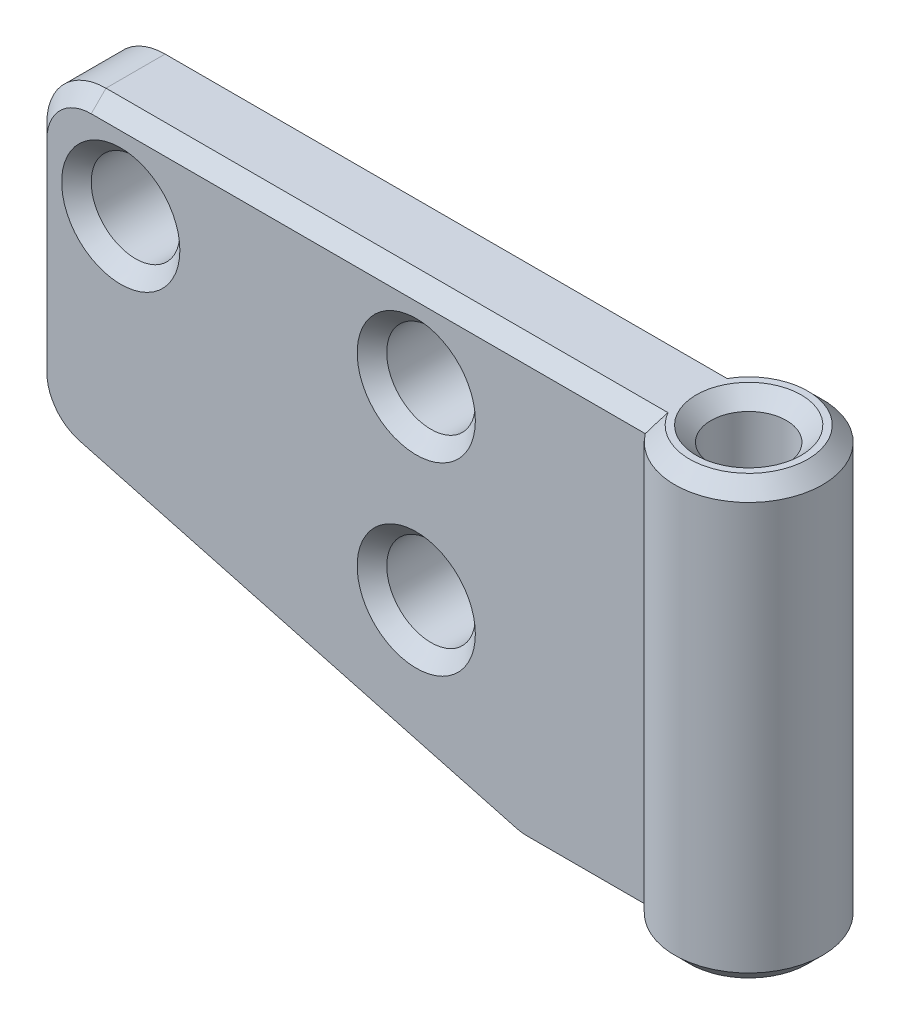
ISO-10303-21;
HEADER;
FILE_DESCRIPTION(('STEP AP214'),'2;1');
FILE_NAME('part.step','',(''),(''),'','','');
FILE_SCHEMA(('AUTOMOTIVE_DESIGN { 1 0 10303 214 1 1 1 1 }'));
ENDSEC;
DATA;
#1=APPLICATION_CONTEXT('core data for automotive mechanical design processes');
#2=APPLICATION_PROTOCOL_DEFINITION('international standard','automotive_design',2000,#1);
#3=PRODUCT_CONTEXT('',#1,'mechanical');
#4=PRODUCT('Part','Part','',(#3));
#5=PRODUCT_RELATED_PRODUCT_CATEGORY('part','',(#4));
#6=PRODUCT_DEFINITION_FORMATION('','',#4);
#7=PRODUCT_DEFINITION_CONTEXT('part definition',#1,'design');
#8=PRODUCT_DEFINITION('design','',#6,#7);
#9=PRODUCT_DEFINITION_SHAPE('','',#8);
#10=(LENGTH_UNIT() NAMED_UNIT(*) SI_UNIT(.MILLI.,.METRE.));
#11=(NAMED_UNIT(*) PLANE_ANGLE_UNIT() SI_UNIT($,.RADIAN.));
#12=(NAMED_UNIT(*) SI_UNIT($,.STERADIAN.) SOLID_ANGLE_UNIT());
#13=UNCERTAINTY_MEASURE_WITH_UNIT(LENGTH_MEASURE(1.E-05),#10,'distance_accuracy_value','');
#14=(GEOMETRIC_REPRESENTATION_CONTEXT(3) GLOBAL_UNCERTAINTY_ASSIGNED_CONTEXT((#13)) GLOBAL_UNIT_ASSIGNED_CONTEXT((#10,
#11,#12)) REPRESENTATION_CONTEXT('',''));
#15=CARTESIAN_POINT('',(0.,0.,0.));
#16=DIRECTION('',(0.,0.,1.));
#17=DIRECTION('',(1.,0.,0.));
#18=AXIS2_PLACEMENT_3D('',#15,#16,#17);
#19=CARTESIAN_POINT('',(27.5266099903496,-19.58,6.));
#20=DIRECTION('',(0.,0.,1.));
#21=DIRECTION('',(1.,0.,0.));
#22=AXIS2_PLACEMENT_3D('',#19,#20,#21);
#23=PLANE('',#22);
#24=CARTESIAN_POINT('',(0.,0.,6.));
#25=DIRECTION('',(0.,0.,1.));
#26=DIRECTION('',(1.,0.,0.));
#27=AXIS2_PLACEMENT_3D('',#24,#25,#26);
#28=CIRCLE('',#27,4.);
#29=CARTESIAN_POINT('',(4.,0.,6.));
#30=VERTEX_POINT('',#29);
#31=EDGE_CURVE('E191',#30,#30,#28,.F.);
#32=ORIENTED_EDGE('',*,*,#31,.T.);
#33=EDGE_LOOP('',(#32));
#34=FACE_BOUND('',#33,.T.);
#35=CARTESIAN_POINT('',(20.,-12.5,6.));
#36=DIRECTION('',(0.,0.,1.));
#37=DIRECTION('',(1.,0.,0.));
#38=AXIS2_PLACEMENT_3D('',#35,#36,#37);
#39=CIRCLE('',#38,4.00000000000001);
#40=CARTESIAN_POINT('',(24.,-12.5,6.));
#41=VERTEX_POINT('',#40);
#42=EDGE_CURVE('E469',#41,#41,#39,.F.);
#43=ORIENTED_EDGE('',*,*,#42,.T.);
#44=EDGE_LOOP('',(#43));
#45=FACE_BOUND('',#44,.T.);
#46=CARTESIAN_POINT('',(20.,0.,6.));
#47=DIRECTION('',(0.,0.,1.));
#48=DIRECTION('',(1.,0.,0.));
#49=AXIS2_PLACEMENT_3D('',#46,#47,#48);
#50=CIRCLE('',#49,4.00000000000001);
#51=CARTESIAN_POINT('',(24.,0.,6.));
#52=VERTEX_POINT('',#51);
#53=EDGE_CURVE('E472',#52,#52,#50,.F.);
#54=ORIENTED_EDGE('',*,*,#53,.T.);
#55=EDGE_LOOP('',(#54));
#56=FACE_BOUND('',#55,.T.);
#57=CARTESIAN_POINT('',(27.5266099903496,-19.58,6.));
#58=DIRECTION('',(0.,0.,1.));
#59=DIRECTION('',(1.,0.,0.));
#60=AXIS2_PLACEMENT_3D('',#57,#58,#59);
#61=CIRCLE('',#60,3.);
#62=CARTESIAN_POINT('',(26.750152855042,-22.4777774788672,6.));
#63=VERTEX_POINT('',#62);
#64=CARTESIAN_POINT('',(27.5266099903496,-22.58,6.));
#65=VERTEX_POINT('',#64);
#66=EDGE_CURVE('E477',#63,#65,#61,.T.);
#67=ORIENTED_EDGE('',*,*,#66,.T.);
#68=DIRECTION('',(1.,0.,0.));
#69=VECTOR('',#68,1.);
#70=CARTESIAN_POINT('',(35.5,-22.58,6.));
#71=LINE('',#70,#69);
#72=CARTESIAN_POINT('',(35.5,-22.58,6.));
#73=VERTEX_POINT('',#72);
#74=EDGE_CURVE('E475',#65,#73,#71,.T.);
#75=ORIENTED_EDGE('',*,*,#74,.T.);
#76=DIRECTION('',(0.,1.,0.));
#77=VECTOR('',#76,1.);
#78=CARTESIAN_POINT('',(35.5,-23.58,6.));
#79=LINE('',#78,#77);
#80=CARTESIAN_POINT('',(35.5,5.,6.));
#81=VERTEX_POINT('',#80);
#82=EDGE_CURVE('E181',#81,#73,#79,.F.);
#83=ORIENTED_EDGE('',*,*,#82,.F.);
#84=DIRECTION('',(-1.,0.,0.));
#85=VECTOR('',#84,1.);
#86=CARTESIAN_POINT('',(-1.99999999999997,5.,6.));
#87=LINE('',#86,#85);
#88=CARTESIAN_POINT('',(-1.99999999999998,5.,6.));
#89=VERTEX_POINT('',#88);
#90=EDGE_CURVE('E421',#81,#89,#87,.T.);
#91=ORIENTED_EDGE('',*,*,#90,.T.);
#92=CARTESIAN_POINT('',(-2.,2.,6.));
#93=DIRECTION('',(0.,0.,1.));
#94=DIRECTION('',(1.,0.,0.));
#95=AXIS2_PLACEMENT_3D('',#92,#93,#94);
#96=CIRCLE('',#95,3.);
#97=CARTESIAN_POINT('',(-5.,1.99999999999997,6.));
#98=VERTEX_POINT('',#97);
#99=EDGE_CURVE('E420',#89,#98,#96,.T.);
#100=ORIENTED_EDGE('',*,*,#99,.T.);
#101=DIRECTION('',(0.,-1.,0.));
#102=VECTOR('',#101,1.);
#103=CARTESIAN_POINT('',(-5.,-11.6683686978573,6.));
#104=LINE('',#103,#102);
#105=CARTESIAN_POINT('',(-5.,-11.6683686978573,6.));
#106=VERTEX_POINT('',#105);
#107=EDGE_CURVE('E483',#98,#106,#104,.T.);
#108=ORIENTED_EDGE('',*,*,#107,.T.);
#109=CARTESIAN_POINT('',(-2.,-11.6683686978573,6.));
#110=DIRECTION('',(0.,0.,1.));
#111=DIRECTION('',(1.,0.,0.));
#112=AXIS2_PLACEMENT_3D('',#109,#110,#111);
#113=CIRCLE('',#112,3.);
#114=CARTESIAN_POINT('',(-2.77645713530754,-14.5661461767245,6.));
#115=VERTEX_POINT('',#114);
#116=EDGE_CURVE('E481',#106,#115,#113,.T.);
#117=ORIENTED_EDGE('',*,*,#116,.T.);
#118=DIRECTION('',(0.96592582628907,-0.258819045102514,0.));
#119=VECTOR('',#118,1.);
#120=CARTESIAN_POINT('',(26.750152855042,-22.4777774788672,6.));
#121=LINE('',#120,#119);
#122=EDGE_CURVE('E479',#115,#63,#121,.T.);
#123=ORIENTED_EDGE('',*,*,#122,.T.);
#124=EDGE_LOOP('',(#67,#75,#83,#91,#100,#108,#117,#123));
#125=FACE_BOUND('',#124,.T.);
#126=ADVANCED_FACE('F40',(#34,#45,#56,#125),#23,.T.);
#127=CARTESIAN_POINT('',(27.5266099903496,-19.58,0.));
#128=DIRECTION('',(0.,0.,1.));
#129=DIRECTION('',(1.,0.,0.));
#130=AXIS2_PLACEMENT_3D('',#127,#128,#129);
#131=PLANE('',#130);
#132=CARTESIAN_POINT('',(0.,0.,0.));
#133=DIRECTION('',(0.,0.,1.));
#134=DIRECTION('',(1.,0.,0.));
#135=AXIS2_PLACEMENT_3D('',#132,#133,#134);
#136=CIRCLE('',#135,4.);
#137=CARTESIAN_POINT('',(4.,0.,0.));
#138=VERTEX_POINT('',#137);
#139=EDGE_CURVE('E505',#138,#138,#136,.T.);
#140=ORIENTED_EDGE('',*,*,#139,.T.);
#141=EDGE_LOOP('',(#140));
#142=FACE_BOUND('',#141,.T.);
#143=CARTESIAN_POINT('',(20.,-12.5,0.));
#144=DIRECTION('',(0.,0.,1.));
#145=DIRECTION('',(1.,0.,0.));
#146=AXIS2_PLACEMENT_3D('',#143,#144,#145);
#147=CIRCLE('',#146,4.00000000000001);
#148=CARTESIAN_POINT('',(24.,-12.5,0.));
#149=VERTEX_POINT('',#148);
#150=EDGE_CURVE('E508',#149,#149,#147,.T.);
#151=ORIENTED_EDGE('',*,*,#150,.T.);
#152=EDGE_LOOP('',(#151));
#153=FACE_BOUND('',#152,.T.);
#154=CARTESIAN_POINT('',(20.,0.,0.));
#155=DIRECTION('',(0.,0.,1.));
#156=DIRECTION('',(1.,0.,0.));
#157=AXIS2_PLACEMENT_3D('',#154,#155,#156);
#158=CIRCLE('',#157,4.00000000000001);
#159=CARTESIAN_POINT('',(24.,0.,0.));
#160=VERTEX_POINT('',#159);
#161=EDGE_CURVE('E511',#160,#160,#158,.T.);
#162=ORIENTED_EDGE('',*,*,#161,.T.);
#163=EDGE_LOOP('',(#162));
#164=FACE_BOUND('',#163,.T.);
#165=DIRECTION('',(0.,1.,0.));
#166=VECTOR('',#165,1.);
#167=CARTESIAN_POINT('',(35.5,-23.58,0.));
#168=LINE('',#167,#166);
#169=CARTESIAN_POINT('',(35.5,5.,0.));
#170=VERTEX_POINT('',#169);
#171=CARTESIAN_POINT('',(35.5,-22.58,0.));
#172=VERTEX_POINT('',#171);
#173=EDGE_CURVE('E163',#170,#172,#168,.F.);
#174=ORIENTED_EDGE('',*,*,#173,.T.);
#175=DIRECTION('',(-1.,0.,0.));
#176=VECTOR('',#175,1.);
#177=CARTESIAN_POINT('',(27.5266099903496,-22.58,0.));
#178=LINE('',#177,#176);
#179=CARTESIAN_POINT('',(27.5266099903496,-22.58,0.));
#180=VERTEX_POINT('',#179);
#181=EDGE_CURVE('E514',#172,#180,#178,.T.);
#182=ORIENTED_EDGE('',*,*,#181,.T.);
#183=CARTESIAN_POINT('',(27.5266099903496,-19.58,0.));
#184=DIRECTION('',(0.,0.,1.));
#185=DIRECTION('',(1.,0.,0.));
#186=AXIS2_PLACEMENT_3D('',#183,#184,#185);
#187=CIRCLE('',#186,3.);
#188=CARTESIAN_POINT('',(26.750152855042,-22.4777774788672,0.));
#189=VERTEX_POINT('',#188);
#190=EDGE_CURVE('E516',#180,#189,#187,.F.);
#191=ORIENTED_EDGE('',*,*,#190,.T.);
#192=DIRECTION('',(-0.96592582628907,0.258819045102514,0.));
#193=VECTOR('',#192,1.);
#194=CARTESIAN_POINT('',(26.750152855042,-22.4777774788672,0.));
#195=LINE('',#194,#193);
#196=CARTESIAN_POINT('',(-2.77645713530754,-14.5661461767245,0.));
#197=VERTEX_POINT('',#196);
#198=EDGE_CURVE('E518',#189,#197,#195,.T.);
#199=ORIENTED_EDGE('',*,*,#198,.T.);
#200=CARTESIAN_POINT('',(-2.,-11.6683686978573,0.));
#201=DIRECTION('',(0.,0.,1.));
#202=DIRECTION('',(1.,0.,0.));
#203=AXIS2_PLACEMENT_3D('',#200,#201,#202);
#204=CIRCLE('',#203,3.);
#205=CARTESIAN_POINT('',(-5.,-11.6683686978573,0.));
#206=VERTEX_POINT('',#205);
#207=EDGE_CURVE('E520',#197,#206,#204,.F.);
#208=ORIENTED_EDGE('',*,*,#207,.T.);
#209=DIRECTION('',(0.,1.,0.));
#210=VECTOR('',#209,1.);
#211=CARTESIAN_POINT('',(-5.,-19.58,0.));
#212=LINE('',#211,#210);
#213=CARTESIAN_POINT('',(-5.,1.99999999999997,0.));
#214=VERTEX_POINT('',#213);
#215=EDGE_CURVE('E522',#206,#214,#212,.T.);
#216=ORIENTED_EDGE('',*,*,#215,.T.);
#217=CARTESIAN_POINT('',(-2.,2.,0.));
#218=DIRECTION('',(0.,0.,1.));
#219=DIRECTION('',(1.,0.,0.));
#220=AXIS2_PLACEMENT_3D('',#217,#218,#219);
#221=CIRCLE('',#220,3.);
#222=CARTESIAN_POINT('',(-1.99999999999998,5.,0.));
#223=VERTEX_POINT('',#222);
#224=EDGE_CURVE('E165',#214,#223,#221,.F.);
#225=ORIENTED_EDGE('',*,*,#224,.T.);
#226=DIRECTION('',(1.,0.,0.));
#227=VECTOR('',#226,1.);
#228=CARTESIAN_POINT('',(27.5266099903496,5.,0.));
#229=LINE('',#228,#227);
#230=EDGE_CURVE('E160',#223,#170,#229,.T.);
#231=ORIENTED_EDGE('',*,*,#230,.T.);
#232=EDGE_LOOP('',(#174,#182,#191,#199,#208,#216,#225,#231));
#233=FACE_BOUND('',#232,.T.);
#234=ADVANCED_FACE('F162',(#142,#153,#164,#233),#131,.F.);
#235=CARTESIAN_POINT('',(27.5266099903496,-19.58,6.));
#236=DIRECTION('',(0.,0.,-1.));
#237=DIRECTION('',(-1.,0.,0.));
#238=AXIS2_PLACEMENT_3D('',#235,#236,#237);
#239=CYLINDRICAL_SURFACE('',#238,4.);
#240=DIRECTION('',(0.,0.,-1.));
#241=VECTOR('',#240,1.);
#242=CARTESIAN_POINT('',(26.4913338099395,-23.4437033051563,6.));
#243=LINE('',#242,#241);
#244=CARTESIAN_POINT('',(26.4913338099395,-23.4437033051563,5.));
#245=VERTEX_POINT('',#244);
#246=CARTESIAN_POINT('',(26.4913338099395,-23.4437033051563,1.));
#247=VERTEX_POINT('',#246);
#248=EDGE_CURVE('E534',#245,#247,#243,.T.);
#249=ORIENTED_EDGE('',*,*,#248,.T.);
#250=CARTESIAN_POINT('',(27.5266099903496,-19.58,1.));
#251=DIRECTION('',(0.,0.,1.));
#252=DIRECTION('',(1.,0.,0.));
#253=AXIS2_PLACEMENT_3D('',#250,#251,#252);
#254=CIRCLE('',#253,4.);
#255=CARTESIAN_POINT('',(27.5266099903496,-23.58,1.));
#256=VERTEX_POINT('',#255);
#257=EDGE_CURVE('E456',#247,#256,#254,.T.);
#258=ORIENTED_EDGE('',*,*,#257,.T.);
#259=DIRECTION('',(0.,0.,-1.));
#260=VECTOR('',#259,1.);
#261=CARTESIAN_POINT('',(27.5266099903496,-23.58,6.));
#262=LINE('',#261,#260);
#263=CARTESIAN_POINT('',(27.5266099903496,-23.58,5.));
#264=VERTEX_POINT('',#263);
#265=EDGE_CURVE('E170',#264,#256,#262,.T.);
#266=ORIENTED_EDGE('',*,*,#265,.F.);
#267=CARTESIAN_POINT('',(27.5266099903496,-19.58,5.));
#268=DIRECTION('',(0.,0.,1.));
#269=DIRECTION('',(1.,0.,0.));
#270=AXIS2_PLACEMENT_3D('',#267,#268,#269);
#271=CIRCLE('',#270,4.);
#272=EDGE_CURVE('E458',#264,#245,#271,.F.);
#273=ORIENTED_EDGE('',*,*,#272,.T.);
#274=EDGE_LOOP('',(#249,#258,#266,#273));
#275=FACE_BOUND('',#274,.T.);
#276=ADVANCED_FACE('F232',(#275),#239,.T.);
#277=CARTESIAN_POINT('',(27.5266099903496,-23.58,6.));
#278=DIRECTION('',(0.,1.,0.));
#279=DIRECTION('',(0.,0.,1.));
#280=AXIS2_PLACEMENT_3D('',#277,#278,#279);
#281=PLANE('',#280);
#282=CARTESIAN_POINT('',(39.5,-23.58,3.));
#283=DIRECTION('',(0.,1.,0.));
#284=DIRECTION('',(0.,0.,1.));
#285=AXIS2_PLACEMENT_3D('',#282,#283,#284);
#286=CIRCLE('',#285,2.55);
#287=CARTESIAN_POINT('',(39.5,-23.58,5.55));
#288=VERTEX_POINT('',#287);
#289=EDGE_CURVE('E182',#288,#288,#286,.T.);
#290=ORIENTED_EDGE('',*,*,#289,.T.);
#291=EDGE_LOOP('',(#290));
#292=FACE_BOUND('',#291,.T.);
#293=ORIENTED_EDGE('',*,*,#265,.T.);
#294=DIRECTION('',(1.,0.,0.));
#295=VECTOR('',#294,1.);
#296=CARTESIAN_POINT('',(27.5266099903496,-23.58,1.));
#297=LINE('',#296,#295);
#298=CARTESIAN_POINT('',(36.0358983848623,-23.58,1.));
#299=VERTEX_POINT('',#298);
#300=EDGE_CURVE('E460',#256,#299,#297,.T.);
#301=ORIENTED_EDGE('',*,*,#300,.T.);
#302=CARTESIAN_POINT('',(39.5,-23.58,3.));
#303=DIRECTION('',(0.,1.,0.));
#304=DIRECTION('',(0.,0.,1.));
#305=AXIS2_PLACEMENT_3D('',#302,#303,#304);
#306=CIRCLE('',#305,4.);
#307=CARTESIAN_POINT('',(36.0358983848623,-23.58,5.));
#308=VERTEX_POINT('',#307);
#309=EDGE_CURVE('E462',#299,#308,#306,.F.);
#310=ORIENTED_EDGE('',*,*,#309,.T.);
#311=DIRECTION('',(-1.,0.,0.));
#312=VECTOR('',#311,1.);
#313=CARTESIAN_POINT('',(27.5266099903496,-23.58,5.));
#314=LINE('',#313,#312);
#315=EDGE_CURVE('E465',#308,#264,#314,.T.);
#316=ORIENTED_EDGE('',*,*,#315,.T.);
#317=EDGE_LOOP('',(#293,#301,#310,#316));
#318=FACE_BOUND('',#317,.T.);
#319=ADVANCED_FACE('F260',(#292,#318),#281,.F.);
#320=CARTESIAN_POINT('',(-1.99999999999997,6.,6.));
#321=DIRECTION('',(0.,-1.,0.));
#322=DIRECTION('',(0.,0.,-1.));
#323=AXIS2_PLACEMENT_3D('',#320,#321,#322);
#324=PLANE('',#323);
#325=CARTESIAN_POINT('',(39.5,6.,3.));
#326=DIRECTION('',(0.,-1.,0.));
#327=DIRECTION('',(0.,0.,-1.));
#328=AXIS2_PLACEMENT_3D('',#325,#326,#327);
#329=CIRCLE('',#328,3.55000000000002);
#330=CARTESIAN_POINT('',(39.5,6.,-0.550000000000019));
#331=VERTEX_POINT('',#330);
#332=EDGE_CURVE('E422',#331,#331,#329,.T.);
#333=ORIENTED_EDGE('',*,*,#332,.T.);
#334=EDGE_LOOP('',(#333));
#335=FACE_BOUND('',#334,.T.);
#336=CARTESIAN_POINT('',(39.5,6.,3.));
#337=DIRECTION('',(0.,-1.,0.));
#338=DIRECTION('',(0.,0.,-1.));
#339=AXIS2_PLACEMENT_3D('',#336,#337,#338);
#340=CIRCLE('',#339,3.99999999999999);
#341=CARTESIAN_POINT('',(36.0358983848623,6.,5.));
#342=VERTEX_POINT('',#341);
#343=CARTESIAN_POINT('',(36.0358983848623,6.,1.));
#344=VERTEX_POINT('',#343);
#345=EDGE_CURVE('E63',#342,#344,#340,.F.);
#346=ORIENTED_EDGE('',*,*,#345,.T.);
#347=DIRECTION('',(-1.,0.,0.));
#348=VECTOR('',#347,1.);
#349=CARTESIAN_POINT('',(-1.99999999999997,6.,1.));
#350=LINE('',#349,#348);
#351=CARTESIAN_POINT('',(-1.99999999999997,6.,1.));
#352=VERTEX_POINT('',#351);
#353=EDGE_CURVE('E55',#344,#352,#350,.T.);
#354=ORIENTED_EDGE('',*,*,#353,.T.);
#355=DIRECTION('',(0.,0.,-1.));
#356=VECTOR('',#355,1.);
#357=CARTESIAN_POINT('',(-1.99999999999997,6.,6.));
#358=LINE('',#357,#356);
#359=CARTESIAN_POINT('',(-1.99999999999997,6.,5.));
#360=VERTEX_POINT('',#359);
#361=EDGE_CURVE('E431',#360,#352,#358,.T.);
#362=ORIENTED_EDGE('',*,*,#361,.F.);
#363=DIRECTION('',(1.,0.,0.));
#364=VECTOR('',#363,1.);
#365=CARTESIAN_POINT('',(35.5,6.,5.));
#366=LINE('',#365,#364);
#367=EDGE_CURVE('E68',#360,#342,#366,.T.);
#368=ORIENTED_EDGE('',*,*,#367,.T.);
#369=EDGE_LOOP('',(#346,#354,#362,#368));
#370=FACE_BOUND('',#369,.T.);
#371=ADVANCED_FACE('F256',(#335,#370),#324,.F.);
#372=CARTESIAN_POINT('',(-2.,2.,6.));
#373=DIRECTION('',(0.,0.,-1.));
#374=DIRECTION('',(-1.,0.,0.));
#375=AXIS2_PLACEMENT_3D('',#372,#373,#374);
#376=CYLINDRICAL_SURFACE('',#375,4.);
#377=ORIENTED_EDGE('',*,*,#361,.T.);
#378=CARTESIAN_POINT('',(-2.,2.,1.));
#379=DIRECTION('',(0.,0.,1.));
#380=DIRECTION('',(1.,0.,0.));
#381=AXIS2_PLACEMENT_3D('',#378,#379,#380);
#382=CIRCLE('',#381,4.);
#383=CARTESIAN_POINT('',(-6.,1.99999999999997,1.));
#384=VERTEX_POINT('',#383);
#385=EDGE_CURVE('E426',#352,#384,#382,.T.);
#386=ORIENTED_EDGE('',*,*,#385,.T.);
#387=DIRECTION('',(0.,0.,-1.));
#388=VECTOR('',#387,1.);
#389=CARTESIAN_POINT('',(-6.,1.99999999999997,6.));
#390=LINE('',#389,#388);
#391=CARTESIAN_POINT('',(-6.,1.99999999999997,5.));
#392=VERTEX_POINT('',#391);
#393=EDGE_CURVE('E435',#392,#384,#390,.T.);
#394=ORIENTED_EDGE('',*,*,#393,.F.);
#395=CARTESIAN_POINT('',(-2.,2.,5.));
#396=DIRECTION('',(0.,0.,1.));
#397=DIRECTION('',(1.,0.,0.));
#398=AXIS2_PLACEMENT_3D('',#395,#396,#397);
#399=CIRCLE('',#398,4.);
#400=EDGE_CURVE('E418',#392,#360,#399,.F.);
#401=ORIENTED_EDGE('',*,*,#400,.T.);
#402=EDGE_LOOP('',(#377,#386,#394,#401));
#403=FACE_BOUND('',#402,.T.);
#404=ADVANCED_FACE('F252',(#403),#376,.T.);
#405=CARTESIAN_POINT('',(-6.,-11.6683686978573,6.));
#406=DIRECTION('',(1.,0.,0.));
#407=DIRECTION('',(0.,1.,0.));
#408=AXIS2_PLACEMENT_3D('',#405,#406,#407);
#409=PLANE('',#408);
#410=ORIENTED_EDGE('',*,*,#393,.T.);
#411=DIRECTION('',(0.,-1.,0.));
#412=VECTOR('',#411,1.);
#413=CARTESIAN_POINT('',(-6.,-11.6683686978573,1.));
#414=LINE('',#413,#412);
#415=CARTESIAN_POINT('',(-6.,-11.6683686978573,1.));
#416=VERTEX_POINT('',#415);
#417=EDGE_CURVE('E442',#384,#416,#414,.T.);
#418=ORIENTED_EDGE('',*,*,#417,.T.);
#419=DIRECTION('',(0.,0.,-1.));
#420=VECTOR('',#419,1.);
#421=CARTESIAN_POINT('',(-6.,-11.6683686978573,6.));
#422=LINE('',#421,#420);
#423=CARTESIAN_POINT('',(-6.,-11.6683686978573,5.));
#424=VERTEX_POINT('',#423);
#425=EDGE_CURVE('E528',#424,#416,#422,.T.);
#426=ORIENTED_EDGE('',*,*,#425,.F.);
#427=DIRECTION('',(0.,1.,0.));
#428=VECTOR('',#427,1.);
#429=CARTESIAN_POINT('',(-6.,1.99999999999997,5.));
#430=LINE('',#429,#428);
#431=EDGE_CURVE('E446',#424,#392,#430,.T.);
#432=ORIENTED_EDGE('',*,*,#431,.T.);
#433=EDGE_LOOP('',(#410,#418,#426,#432));
#434=FACE_BOUND('',#433,.T.);
#435=ADVANCED_FACE('F248',(#434),#409,.F.);
#436=CARTESIAN_POINT('',(-2.,-11.6683686978573,6.));
#437=DIRECTION('',(0.,0.,-1.));
#438=DIRECTION('',(-1.,0.,0.));
#439=AXIS2_PLACEMENT_3D('',#436,#437,#438);
#440=CYLINDRICAL_SURFACE('',#439,4.);
#441=ORIENTED_EDGE('',*,*,#425,.T.);
#442=CARTESIAN_POINT('',(-2.,-11.6683686978573,1.));
#443=DIRECTION('',(0.,0.,1.));
#444=DIRECTION('',(1.,0.,0.));
#445=AXIS2_PLACEMENT_3D('',#442,#443,#444);
#446=CIRCLE('',#445,4.);
#447=CARTESIAN_POINT('',(-3.03527618041006,-15.5320720030136,1.));
#448=VERTEX_POINT('',#447);
#449=EDGE_CURVE('E448',#416,#448,#446,.T.);
#450=ORIENTED_EDGE('',*,*,#449,.T.);
#451=DIRECTION('',(0.,0.,-1.));
#452=VECTOR('',#451,1.);
#453=CARTESIAN_POINT('',(-3.03527618041006,-15.5320720030136,6.));
#454=LINE('',#453,#452);
#455=CARTESIAN_POINT('',(-3.03527618041006,-15.5320720030136,5.));
#456=VERTEX_POINT('',#455);
#457=EDGE_CURVE('E531',#456,#448,#454,.T.);
#458=ORIENTED_EDGE('',*,*,#457,.F.);
#459=CARTESIAN_POINT('',(-2.,-11.6683686978573,5.));
#460=DIRECTION('',(0.,0.,1.));
#461=DIRECTION('',(1.,0.,0.));
#462=AXIS2_PLACEMENT_3D('',#459,#460,#461);
#463=CIRCLE('',#462,4.);
#464=EDGE_CURVE('E450',#456,#424,#463,.F.);
#465=ORIENTED_EDGE('',*,*,#464,.T.);
#466=EDGE_LOOP('',(#441,#450,#458,#465));
#467=FACE_BOUND('',#466,.T.);
#468=ADVANCED_FACE('F244',(#467),#440,.T.);
#469=CARTESIAN_POINT('',(26.4913338099395,-23.4437033051563,6.));
#470=DIRECTION('',(0.258819045102514,0.96592582628907,0.));
#471=DIRECTION('',(-0.96592582628907,0.258819045102514,0.));
#472=AXIS2_PLACEMENT_3D('',#469,#470,#471);
#473=PLANE('',#472);
#474=ORIENTED_EDGE('',*,*,#457,.T.);
#475=DIRECTION('',(0.96592582628907,-0.258819045102514,0.));
#476=VECTOR('',#475,1.);
#477=CARTESIAN_POINT('',(26.4913338099395,-23.4437033051563,1.));
#478=LINE('',#477,#476);
#479=EDGE_CURVE('E452',#448,#247,#478,.T.);
#480=ORIENTED_EDGE('',*,*,#479,.T.);
#481=ORIENTED_EDGE('',*,*,#248,.F.);
#482=DIRECTION('',(-0.96592582628907,0.258819045102514,0.));
#483=VECTOR('',#482,1.);
#484=CARTESIAN_POINT('',(-3.03527618041006,-15.5320720030136,5.));
#485=LINE('',#484,#483);
#486=EDGE_CURVE('E454',#245,#456,#485,.T.);
#487=ORIENTED_EDGE('',*,*,#486,.T.);
#488=EDGE_LOOP('',(#474,#480,#481,#487));
#489=FACE_BOUND('',#488,.T.);
#490=ADVANCED_FACE('F241',(#489),#473,.F.);
#491=CARTESIAN_POINT('',(0.,0.,6.));
#492=DIRECTION('',(0.,0.,-1.));
#493=DIRECTION('',(-1.,0.,0.));
#494=AXIS2_PLACEMENT_3D('',#491,#492,#493);
#495=CYLINDRICAL_SURFACE('',#494,3.);
#496=CARTESIAN_POINT('',(0.,0.,1.00000000000001));
#497=DIRECTION('',(0.,0.,1.));
#498=DIRECTION('',(1.,0.,0.));
#499=AXIS2_PLACEMENT_3D('',#496,#497,#498);
#500=CIRCLE('',#499,3.);
#501=CARTESIAN_POINT('',(3.,0.,1.00000000000001));
#502=VERTEX_POINT('',#501);
#503=EDGE_CURVE('E499',#502,#502,#500,.F.);
#504=ORIENTED_EDGE('',*,*,#503,.T.);
#505=EDGE_LOOP('',(#504));
#506=FACE_BOUND('',#505,.T.);
#507=CARTESIAN_POINT('',(0.,0.,5.));
#508=DIRECTION('',(0.,0.,1.));
#509=DIRECTION('',(1.,0.,0.));
#510=AXIS2_PLACEMENT_3D('',#507,#508,#509);
#511=CIRCLE('',#510,3.);
#512=CARTESIAN_POINT('',(3.,0.,5.));
#513=VERTEX_POINT('',#512);
#514=EDGE_CURVE('E502',#513,#513,#511,.T.);
#515=ORIENTED_EDGE('',*,*,#514,.T.);
#516=EDGE_LOOP('',(#515));
#517=FACE_BOUND('',#516,.T.);
#518=ADVANCED_FACE('F238',(#506,#517),#495,.F.);
#519=CARTESIAN_POINT('',(20.,0.,6.));
#520=DIRECTION('',(0.,0.,-1.));
#521=DIRECTION('',(-1.,0.,0.));
#522=AXIS2_PLACEMENT_3D('',#519,#520,#521);
#523=CYLINDRICAL_SURFACE('',#522,3.);
#524=CARTESIAN_POINT('',(20.,0.,1.00000000000001));
#525=DIRECTION('',(0.,0.,1.));
#526=DIRECTION('',(1.,0.,0.));
#527=AXIS2_PLACEMENT_3D('',#524,#525,#526);
#528=CIRCLE('',#527,3.);
#529=CARTESIAN_POINT('',(23.,0.,1.00000000000001));
#530=VERTEX_POINT('',#529);
#531=EDGE_CURVE('E487',#530,#530,#528,.F.);
#532=ORIENTED_EDGE('',*,*,#531,.T.);
#533=EDGE_LOOP('',(#532));
#534=FACE_BOUND('',#533,.T.);
#535=CARTESIAN_POINT('',(20.,0.,5.));
#536=DIRECTION('',(0.,0.,1.));
#537=DIRECTION('',(1.,0.,0.));
#538=AXIS2_PLACEMENT_3D('',#535,#536,#537);
#539=CIRCLE('',#538,3.);
#540=CARTESIAN_POINT('',(23.,0.,5.));
#541=VERTEX_POINT('',#540);
#542=EDGE_CURVE('E490',#541,#541,#539,.T.);
#543=ORIENTED_EDGE('',*,*,#542,.T.);
#544=EDGE_LOOP('',(#543));
#545=FACE_BOUND('',#544,.T.);
#546=ADVANCED_FACE('F552',(#534,#545),#523,.F.);
#547=CARTESIAN_POINT('',(20.,-12.5,6.));
#548=DIRECTION('',(0.,0.,-1.));
#549=DIRECTION('',(-1.,0.,0.));
#550=AXIS2_PLACEMENT_3D('',#547,#548,#549);
#551=CYLINDRICAL_SURFACE('',#550,3.);
#552=CARTESIAN_POINT('',(20.,-12.5,1.00000000000001));
#553=DIRECTION('',(0.,0.,1.));
#554=DIRECTION('',(1.,0.,0.));
#555=AXIS2_PLACEMENT_3D('',#552,#553,#554);
#556=CIRCLE('',#555,3.);
#557=CARTESIAN_POINT('',(23.,-12.5,1.00000000000001));
#558=VERTEX_POINT('',#557);
#559=EDGE_CURVE('E493',#558,#558,#556,.F.);
#560=ORIENTED_EDGE('',*,*,#559,.T.);
#561=EDGE_LOOP('',(#560));
#562=FACE_BOUND('',#561,.T.);
#563=CARTESIAN_POINT('',(20.,-12.5,5.));
#564=DIRECTION('',(0.,0.,1.));
#565=DIRECTION('',(1.,0.,0.));
#566=AXIS2_PLACEMENT_3D('',#563,#564,#565);
#567=CIRCLE('',#566,3.);
#568=CARTESIAN_POINT('',(23.,-12.5,5.));
#569=VERTEX_POINT('',#568);
#570=EDGE_CURVE('E496',#569,#569,#567,.T.);
#571=ORIENTED_EDGE('',*,*,#570,.T.);
#572=EDGE_LOOP('',(#571));
#573=FACE_BOUND('',#572,.T.);
#574=ADVANCED_FACE('F548',(#562,#573),#551,.F.);
#575=CARTESIAN_POINT('',(39.5,-23.58,3.));
#576=DIRECTION('',(0.,1.,0.));
#577=DIRECTION('',(0.,0.,1.));
#578=AXIS2_PLACEMENT_3D('',#575,#576,#577);
#579=CYLINDRICAL_SURFACE('',#578,5.);
#580=ORIENTED_EDGE('',*,*,#82,.T.);
#581=CARTESIAN_POINT('',(39.5,-22.58,3.));
#582=DIRECTION('',(0.,1.,0.));
#583=DIRECTION('',(0.,0.,1.));
#584=AXIS2_PLACEMENT_3D('',#581,#582,#583);
#585=CIRCLE('',#584,5.);
#586=EDGE_CURVE('E180',#73,#172,#585,.T.);
#587=ORIENTED_EDGE('',*,*,#586,.T.);
#588=ORIENTED_EDGE('',*,*,#173,.F.);
#589=CARTESIAN_POINT('',(39.5,5.,3.));
#590=DIRECTION('',(0.,-1.,0.));
#591=DIRECTION('',(0.,0.,-1.));
#592=AXIS2_PLACEMENT_3D('',#589,#590,#591);
#593=CIRCLE('',#592,5.);
#594=EDGE_CURVE('E177',#170,#81,#593,.T.);
#595=ORIENTED_EDGE('',*,*,#594,.T.);
#596=EDGE_LOOP('',(#580,#587,#588,#595));
#597=FACE_BOUND('',#596,.T.);
#598=ADVANCED_FACE('F176',(#597),#579,.T.);
#599=CARTESIAN_POINT('',(39.5,-23.58,3.));
#600=DIRECTION('',(0.,1.,0.));
#601=DIRECTION('',(0.,0.,1.));
#602=AXIS2_PLACEMENT_3D('',#599,#600,#601);
#603=CYLINDRICAL_SURFACE('',#602,2.55);
#604=CARTESIAN_POINT('',(39.5,4.99999999999998,3.));
#605=DIRECTION('',(0.,-1.,0.));
#606=DIRECTION('',(0.,0.,-1.));
#607=AXIS2_PLACEMENT_3D('',#604,#605,#606);
#608=CIRCLE('',#607,2.55);
#609=CARTESIAN_POINT('',(39.5,4.99999999999998,0.450000000000001));
#610=VERTEX_POINT('',#609);
#611=EDGE_CURVE('E11',#610,#610,#608,.F.);
#612=ORIENTED_EDGE('',*,*,#611,.T.);
#613=EDGE_LOOP('',(#612));
#614=FACE_BOUND('',#613,.T.);
#615=ORIENTED_EDGE('',*,*,#289,.F.);
#616=EDGE_LOOP('',(#615));
#617=FACE_BOUND('',#616,.T.);
#618=ADVANCED_FACE('F276',(#614,#617),#603,.F.);
#619=CARTESIAN_POINT('',(0.,0.,0.));
#620=DIRECTION('',(0.,0.,-1.));
#621=DIRECTION('',(-1.,0.,0.));
#622=AXIS2_PLACEMENT_3D('',#619,#620,#621);
#623=CONICAL_SURFACE('',#622,4.,0.785398163397446);
#624=ORIENTED_EDGE('',*,*,#503,.F.);
#625=EDGE_LOOP('',(#624));
#626=FACE_BOUND('',#625,.T.);
#627=ORIENTED_EDGE('',*,*,#139,.F.);
#628=EDGE_LOOP('',(#627));
#629=FACE_BOUND('',#628,.T.);
#630=ADVANCED_FACE('F269',(#626,#629),#623,.F.);
#631=CARTESIAN_POINT('',(20.,-12.5,0.));
#632=DIRECTION('',(0.,0.,-1.));
#633=DIRECTION('',(-1.,0.,0.));
#634=AXIS2_PLACEMENT_3D('',#631,#632,#633);
#635=CONICAL_SURFACE('',#634,4.00000000000001,0.785398163397448);
#636=ORIENTED_EDGE('',*,*,#559,.F.);
#637=EDGE_LOOP('',(#636));
#638=FACE_BOUND('',#637,.T.);
#639=ORIENTED_EDGE('',*,*,#150,.F.);
#640=EDGE_LOOP('',(#639));
#641=FACE_BOUND('',#640,.T.);
#642=ADVANCED_FACE('F275',(#638,#641),#635,.F.);
#643=CARTESIAN_POINT('',(20.,0.,0.));
#644=DIRECTION('',(0.,0.,-1.));
#645=DIRECTION('',(-1.,0.,0.));
#646=AXIS2_PLACEMENT_3D('',#643,#644,#645);
#647=CONICAL_SURFACE('',#646,4.00000000000001,0.785398163397448);
#648=ORIENTED_EDGE('',*,*,#531,.F.);
#649=EDGE_LOOP('',(#648));
#650=FACE_BOUND('',#649,.T.);
#651=ORIENTED_EDGE('',*,*,#161,.F.);
#652=EDGE_LOOP('',(#651));
#653=FACE_BOUND('',#652,.T.);
#654=ADVANCED_FACE('F283',(#650,#653),#647,.F.);
#655=CARTESIAN_POINT('',(0.,0.,5.));
#656=DIRECTION('',(0.,0.,1.));
#657=DIRECTION('',(1.,0.,0.));
#658=AXIS2_PLACEMENT_3D('',#655,#656,#657);
#659=CONICAL_SURFACE('',#658,3.,0.78539816339745);
#660=ORIENTED_EDGE('',*,*,#31,.F.);
#661=EDGE_LOOP('',(#660));
#662=FACE_BOUND('',#661,.T.);
#663=ORIENTED_EDGE('',*,*,#514,.F.);
#664=EDGE_LOOP('',(#663));
#665=FACE_BOUND('',#664,.T.);
#666=ADVANCED_FACE('F290',(#662,#665),#659,.F.);
#667=CARTESIAN_POINT('',(20.,-12.5,5.));
#668=DIRECTION('',(0.,0.,1.));
#669=DIRECTION('',(1.,0.,0.));
#670=AXIS2_PLACEMENT_3D('',#667,#668,#669);
#671=CONICAL_SURFACE('',#670,3.,0.785398163397452);
#672=ORIENTED_EDGE('',*,*,#42,.F.);
#673=EDGE_LOOP('',(#672));
#674=FACE_BOUND('',#673,.T.);
#675=ORIENTED_EDGE('',*,*,#570,.F.);
#676=EDGE_LOOP('',(#675));
#677=FACE_BOUND('',#676,.T.);
#678=ADVANCED_FACE('F297',(#674,#677),#671,.F.);
#679=CARTESIAN_POINT('',(20.,0.,5.));
#680=DIRECTION('',(0.,0.,1.));
#681=DIRECTION('',(1.,0.,0.));
#682=AXIS2_PLACEMENT_3D('',#679,#680,#681);
#683=CONICAL_SURFACE('',#682,3.,0.785398163397452);
#684=ORIENTED_EDGE('',*,*,#53,.F.);
#685=EDGE_LOOP('',(#684));
#686=FACE_BOUND('',#685,.T.);
#687=ORIENTED_EDGE('',*,*,#542,.F.);
#688=EDGE_LOOP('',(#687));
#689=FACE_BOUND('',#688,.T.);
#690=ADVANCED_FACE('F214',(#686,#689),#683,.F.);
#691=CARTESIAN_POINT('',(39.5,6.,3.));
#692=DIRECTION('',(0.,-1.,0.));
#693=DIRECTION('',(0.,0.,-1.));
#694=AXIS2_PLACEMENT_3D('',#691,#692,#693);
#695=CONICAL_SURFACE('',#694,4.,0.785398163397448);
#696=CARTESIAN_POINT('',(35.5,5.,0.));
#697=CARTESIAN_POINT('',(35.5420179986841,5.08403021652764,0.0840302165276401));
#698=CARTESIAN_POINT('',(35.5846197615901,5.1679154636215,0.167915463621506));
#699=CARTESIAN_POINT('',(35.6710966641976,5.33534352645982,0.335343526459822));
#700=CARTESIAN_POINT('',(35.7149716230718,5.41888638892704,0.418886388927038));
#701=CARTESIAN_POINT('',(35.8041142771476,5.58560414005497,0.585604140054968));
#702=CARTESIAN_POINT('',(35.8493820253128,5.66877901458428,0.668779014584284));
#703=CARTESIAN_POINT('',(35.9414542148768,5.83471572064513,0.834715720645127));
#704=CARTESIAN_POINT('',(35.9882588727702,5.91747749207752,0.917477492077517));
#705=CARTESIAN_POINT('',(36.0358983848623,6.,1.));
#706=B_SPLINE_CURVE_WITH_KNOTS('',3,(#696,#697,#698,#699,#700,#701,#702,#703,#704,#705),
.UNSPECIFIED.,.F.,.F.,(4,2,2,2,4),(0.,0.378139213276168,0.756224981195065,1.1343251444093,
1.51247879857981),.UNSPECIFIED.);
#707=EDGE_CURVE('E187',#344,#170,#706,.F.);
#708=ORIENTED_EDGE('',*,*,#707,.F.);
#709=ORIENTED_EDGE('',*,*,#345,.F.);
#710=CARTESIAN_POINT('',(35.5,5.,6.));
#711=CARTESIAN_POINT('',(35.5420179986841,5.08403021652764,5.91596978347236));
#712=CARTESIAN_POINT('',(35.5846197615901,5.1679154636215,5.83208453637849));
#713=CARTESIAN_POINT('',(35.6710966641976,5.33534352645982,5.66465647354018));
#714=CARTESIAN_POINT('',(35.7149716230718,5.41888638892704,5.58111361107296));
#715=CARTESIAN_POINT('',(35.8041142771476,5.58560414005497,5.41439585994503));
#716=CARTESIAN_POINT('',(35.8493820253128,5.66877901458428,5.33122098541572));
#717=CARTESIAN_POINT('',(35.9414542148768,5.83471572064513,5.16528427935487));
#718=CARTESIAN_POINT('',(35.9882588727702,5.91747749207752,5.08252250792248));
#719=CARTESIAN_POINT('',(36.0358983848623,6.,5.));
#720=B_SPLINE_CURVE_WITH_KNOTS('',3,(#710,#711,#712,#713,#714,#715,#716,#717,#718,#719),
.UNSPECIFIED.,.F.,.F.,(4,2,2,2,4),(0.,0.378139213276168,0.756224981195065,1.1343251444093,
1.51247879857981),.UNSPECIFIED.);
#721=EDGE_CURVE('E45',#81,#342,#720,.T.);
#722=ORIENTED_EDGE('',*,*,#721,.F.);
#723=ORIENTED_EDGE('',*,*,#594,.F.);
#724=EDGE_LOOP('',(#708,#709,#722,#723));
#725=FACE_BOUND('',#724,.T.);
#726=ADVANCED_FACE('F186',(#725),#695,.T.);
#727=CARTESIAN_POINT('',(27.5266099903496,5.,6.));
#728=DIRECTION('',(0.,0.707106781186547,0.707106781186548));
#729=DIRECTION('',(1.,0.,0.));
#730=AXIS2_PLACEMENT_3D('',#727,#728,#729);
#731=PLANE('',#730);
#732=ORIENTED_EDGE('',*,*,#721,.T.);
#733=ORIENTED_EDGE('',*,*,#367,.F.);
#734=DIRECTION('',(0.,0.707106781186548,-0.707106781186547));
#735=VECTOR('',#734,1.);
#736=CARTESIAN_POINT('',(-1.99999999999998,5.,6.));
#737=LINE('',#736,#735);
#738=EDGE_CURVE('E194',#89,#360,#737,.T.);
#739=ORIENTED_EDGE('',*,*,#738,.F.);
#740=ORIENTED_EDGE('',*,*,#90,.F.);
#741=EDGE_LOOP('',(#732,#733,#739,#740));
#742=FACE_BOUND('',#741,.T.);
#743=ADVANCED_FACE('F213',(#742),#731,.T.);
#744=CARTESIAN_POINT('',(-1.99999999999997,6.,1.));
#745=DIRECTION('',(0.,-0.707106781186547,0.707106781186548));
#746=DIRECTION('',(-1.,0.,0.));
#747=AXIS2_PLACEMENT_3D('',#744,#745,#746);
#748=PLANE('',#747);
#749=ORIENTED_EDGE('',*,*,#707,.T.);
#750=ORIENTED_EDGE('',*,*,#230,.F.);
#751=DIRECTION('',(0.,-0.707106781186548,-0.707106781186547));
#752=VECTOR('',#751,1.);
#753=CARTESIAN_POINT('',(-1.99999999999997,6.,1.));
#754=LINE('',#753,#752);
#755=EDGE_CURVE('E196',#352,#223,#754,.T.);
#756=ORIENTED_EDGE('',*,*,#755,.F.);
#757=ORIENTED_EDGE('',*,*,#353,.F.);
#758=EDGE_LOOP('',(#749,#750,#756,#757));
#759=FACE_BOUND('',#758,.T.);
#760=ADVANCED_FACE('F193',(#759),#748,.F.);
#761=CARTESIAN_POINT('',(-2.,2.,6.));
#762=DIRECTION('',(0.,0.,-1.));
#763=DIRECTION('',(-1.,0.,0.));
#764=AXIS2_PLACEMENT_3D('',#761,#762,#763);
#765=CONICAL_SURFACE('',#764,3.,0.785398163397448);
#766=ORIENTED_EDGE('',*,*,#738,.T.);
#767=ORIENTED_EDGE('',*,*,#400,.F.);
#768=DIRECTION('',(-0.707106781186547,0.,-0.707106781186547));
#769=VECTOR('',#768,1.);
#770=CARTESIAN_POINT('',(-5.,1.99999999999997,6.));
#771=LINE('',#770,#769);
#772=EDGE_CURVE('E437',#98,#392,#771,.T.);
#773=ORIENTED_EDGE('',*,*,#772,.F.);
#774=ORIENTED_EDGE('',*,*,#99,.F.);
#775=EDGE_LOOP('',(#766,#767,#773,#774));
#776=FACE_BOUND('',#775,.T.);
#777=ADVANCED_FACE('F225',(#776),#765,.T.);
#778=CARTESIAN_POINT('',(-2.,2.,1.));
#779=DIRECTION('',(0.,0.,1.));
#780=DIRECTION('',(1.,0.,0.));
#781=AXIS2_PLACEMENT_3D('',#778,#779,#780);
#782=CONICAL_SURFACE('',#781,4.,0.785398163397448);
#783=ORIENTED_EDGE('',*,*,#755,.T.);
#784=ORIENTED_EDGE('',*,*,#224,.F.);
#785=DIRECTION('',(0.707106781186547,0.,-0.707106781186547));
#786=VECTOR('',#785,1.);
#787=CARTESIAN_POINT('',(-6.,1.99999999999997,1.));
#788=LINE('',#787,#786);
#789=EDGE_CURVE('E440',#384,#214,#788,.T.);
#790=ORIENTED_EDGE('',*,*,#789,.F.);
#791=ORIENTED_EDGE('',*,*,#385,.F.);
#792=EDGE_LOOP('',(#783,#784,#790,#791));
#793=FACE_BOUND('',#792,.T.);
#794=ADVANCED_FACE('F401',(#793),#782,.T.);
#795=CARTESIAN_POINT('',(-5.,-19.58,6.));
#796=DIRECTION('',(-0.707106781186546,0.,0.707106781186549));
#797=DIRECTION('',(0.,1.,0.));
#798=AXIS2_PLACEMENT_3D('',#795,#796,#797);
#799=PLANE('',#798);
#800=ORIENTED_EDGE('',*,*,#772,.T.);
#801=ORIENTED_EDGE('',*,*,#431,.F.);
#802=DIRECTION('',(-0.707106781186549,0.,-0.707106781186546));
#803=VECTOR('',#802,1.);
#804=CARTESIAN_POINT('',(-5.,-11.6683686978573,6.));
#805=LINE('',#804,#803);
#806=EDGE_CURVE('E899',#106,#424,#805,.T.);
#807=ORIENTED_EDGE('',*,*,#806,.F.);
#808=ORIENTED_EDGE('',*,*,#107,.F.);
#809=EDGE_LOOP('',(#800,#801,#807,#808));
#810=FACE_BOUND('',#809,.T.);
#811=ADVANCED_FACE('F394',(#810),#799,.T.);
#812=CARTESIAN_POINT('',(-6.,-11.6683686978573,1.));
#813=DIRECTION('',(0.707106781186546,0.,0.707106781186549));
#814=DIRECTION('',(0.,-1.,0.));
#815=AXIS2_PLACEMENT_3D('',#812,#813,#814);
#816=PLANE('',#815);
#817=ORIENTED_EDGE('',*,*,#789,.T.);
#818=ORIENTED_EDGE('',*,*,#215,.F.);
#819=DIRECTION('',(0.707106781186549,0.,-0.707106781186546));
#820=VECTOR('',#819,1.);
#821=CARTESIAN_POINT('',(-6.,-11.6683686978573,1.));
#822=LINE('',#821,#820);
#823=EDGE_CURVE('E896',#416,#206,#822,.T.);
#824=ORIENTED_EDGE('',*,*,#823,.F.);
#825=ORIENTED_EDGE('',*,*,#417,.F.);
#826=EDGE_LOOP('',(#817,#818,#824,#825));
#827=FACE_BOUND('',#826,.T.);
#828=ADVANCED_FACE('F387',(#827),#816,.F.);
#829=CARTESIAN_POINT('',(-2.,-11.6683686978573,6.));
#830=DIRECTION('',(0.,0.,-1.));
#831=DIRECTION('',(-1.,0.,0.));
#832=AXIS2_PLACEMENT_3D('',#829,#830,#831);
#833=CONICAL_SURFACE('',#832,3.,0.785398163397449);
#834=ORIENTED_EDGE('',*,*,#806,.T.);
#835=ORIENTED_EDGE('',*,*,#464,.F.);
#836=DIRECTION('',(-0.183012701892215,-0.683012701892221,-0.707106781186547));
#837=VECTOR('',#836,1.);
#838=CARTESIAN_POINT('',(-2.77645713530754,-14.5661461767245,6.));
#839=LINE('',#838,#837);
#840=EDGE_CURVE('E893',#115,#456,#839,.T.);
#841=ORIENTED_EDGE('',*,*,#840,.F.);
#842=ORIENTED_EDGE('',*,*,#116,.F.);
#843=EDGE_LOOP('',(#834,#835,#841,#842));
#844=FACE_BOUND('',#843,.T.);
#845=ADVANCED_FACE('F380',(#844),#833,.T.);
#846=CARTESIAN_POINT('',(-2.,-11.6683686978573,1.));
#847=DIRECTION('',(0.,0.,1.));
#848=DIRECTION('',(1.,0.,0.));
#849=AXIS2_PLACEMENT_3D('',#846,#847,#848);
#850=CONICAL_SURFACE('',#849,4.,0.785398163397448);
#851=ORIENTED_EDGE('',*,*,#823,.T.);
#852=ORIENTED_EDGE('',*,*,#207,.F.);
#853=DIRECTION('',(0.183012701892215,0.683012701892221,-0.707106781186547));
#854=VECTOR('',#853,1.);
#855=CARTESIAN_POINT('',(-3.03527618041006,-15.5320720030136,1.));
#856=LINE('',#855,#854);
#857=EDGE_CURVE('E890',#448,#197,#856,.T.);
#858=ORIENTED_EDGE('',*,*,#857,.F.);
#859=ORIENTED_EDGE('',*,*,#449,.F.);
#860=EDGE_LOOP('',(#851,#852,#858,#859));
#861=FACE_BOUND('',#860,.T.);
#862=ADVANCED_FACE('F373',(#861),#850,.T.);
#863=CARTESIAN_POINT('',(26.750152855042,-22.4777774788672,6.));
#864=DIRECTION('',(-0.183012701892215,-0.68301270189222,0.707106781186548));
#865=DIRECTION('',(-0.96592582628907,0.258819045102514,0.));
#866=AXIS2_PLACEMENT_3D('',#863,#864,#865);
#867=PLANE('',#866);
#868=ORIENTED_EDGE('',*,*,#840,.T.);
#869=ORIENTED_EDGE('',*,*,#486,.F.);
#870=DIRECTION('',(-0.183012701892216,-0.683012701892221,-0.707106781186547));
#871=VECTOR('',#870,1.);
#872=CARTESIAN_POINT('',(26.750152855042,-22.4777774788672,6.));
#873=LINE('',#872,#871);
#874=EDGE_CURVE('E885',#63,#245,#873,.T.);
#875=ORIENTED_EDGE('',*,*,#874,.F.);
#876=ORIENTED_EDGE('',*,*,#122,.F.);
#877=EDGE_LOOP('',(#868,#869,#875,#876));
#878=FACE_BOUND('',#877,.T.);
#879=ADVANCED_FACE('F366',(#878),#867,.T.);
#880=CARTESIAN_POINT('',(26.4913338099395,-23.4437033051563,1.));
#881=DIRECTION('',(0.183012701892215,0.68301270189222,0.707106781186548));
#882=DIRECTION('',(0.96592582628907,-0.258819045102514,0.));
#883=AXIS2_PLACEMENT_3D('',#880,#881,#882);
#884=PLANE('',#883);
#885=ORIENTED_EDGE('',*,*,#857,.T.);
#886=ORIENTED_EDGE('',*,*,#198,.F.);
#887=DIRECTION('',(0.183012701892216,0.683012701892221,-0.707106781186547));
#888=VECTOR('',#887,1.);
#889=CARTESIAN_POINT('',(26.4913338099395,-23.4437033051563,1.));
#890=LINE('',#889,#888);
#891=EDGE_CURVE('E880',#247,#189,#890,.T.);
#892=ORIENTED_EDGE('',*,*,#891,.F.);
#893=ORIENTED_EDGE('',*,*,#479,.F.);
#894=EDGE_LOOP('',(#885,#886,#892,#893));
#895=FACE_BOUND('',#894,.T.);
#896=ADVANCED_FACE('F359',(#895),#884,.F.);
#897=CARTESIAN_POINT('',(27.5266099903496,-19.58,6.));
#898=DIRECTION('',(0.,0.,-1.));
#899=DIRECTION('',(-1.,0.,0.));
#900=AXIS2_PLACEMENT_3D('',#897,#898,#899);
#901=CONICAL_SURFACE('',#900,3.,0.785398163397448);
#902=ORIENTED_EDGE('',*,*,#874,.T.);
#903=ORIENTED_EDGE('',*,*,#272,.F.);
#904=DIRECTION('',(0.,-0.707106781186547,-0.707106781186547));
#905=VECTOR('',#904,1.);
#906=CARTESIAN_POINT('',(27.5266099903496,-22.58,6.));
#907=LINE('',#906,#905);
#908=EDGE_CURVE('E878',#65,#264,#907,.T.);
#909=ORIENTED_EDGE('',*,*,#908,.F.);
#910=ORIENTED_EDGE('',*,*,#66,.F.);
#911=EDGE_LOOP('',(#902,#903,#909,#910));
#912=FACE_BOUND('',#911,.T.);
#913=ADVANCED_FACE('F352',(#912),#901,.T.);
#914=CARTESIAN_POINT('',(27.5266099903496,-19.58,1.));
#915=DIRECTION('',(0.,0.,1.));
#916=DIRECTION('',(1.,0.,0.));
#917=AXIS2_PLACEMENT_3D('',#914,#915,#916);
#918=CONICAL_SURFACE('',#917,4.,0.785398163397448);
#919=ORIENTED_EDGE('',*,*,#891,.T.);
#920=ORIENTED_EDGE('',*,*,#190,.F.);
#921=DIRECTION('',(0.,0.707106781186547,-0.707106781186547));
#922=VECTOR('',#921,1.);
#923=CARTESIAN_POINT('',(27.5266099903496,-23.58,1.));
#924=LINE('',#923,#922);
#925=EDGE_CURVE('E335',#256,#180,#924,.T.);
#926=ORIENTED_EDGE('',*,*,#925,.F.);
#927=ORIENTED_EDGE('',*,*,#257,.F.);
#928=EDGE_LOOP('',(#919,#920,#926,#927));
#929=FACE_BOUND('',#928,.T.);
#930=ADVANCED_FACE('F345',(#929),#918,.T.);
#931=CARTESIAN_POINT('',(27.5266099903496,-22.58,6.));
#932=DIRECTION('',(0.,-0.707106781186547,0.707106781186547));
#933=DIRECTION('',(-1.,0.,0.));
#934=AXIS2_PLACEMENT_3D('',#931,#932,#933);
#935=PLANE('',#934);
#936=ORIENTED_EDGE('',*,*,#908,.T.);
#937=ORIENTED_EDGE('',*,*,#315,.F.);
#938=CARTESIAN_POINT('',(36.0358983848623,-23.58,5.));
#939=CARTESIAN_POINT('',(35.9882588727702,-23.4974774920775,5.08252250792248));
#940=CARTESIAN_POINT('',(35.9414542148768,-23.4147157206451,5.16528427935487));
#941=CARTESIAN_POINT('',(35.8493820253128,-23.2487790145843,5.33122098541571));
#942=CARTESIAN_POINT('',(35.8041142771476,-23.165604140055,5.41439585994503));
#943=CARTESIAN_POINT('',(35.7149716230718,-22.998886388927,5.58111361107296));
#944=CARTESIAN_POINT('',(35.6710966641976,-22.9153435264598,5.66465647354018));
#945=CARTESIAN_POINT('',(35.5846197615901,-22.7479154636215,5.8320845363785));
#946=CARTESIAN_POINT('',(35.5420179986841,-22.6640302165276,5.91596978347236));
#947=CARTESIAN_POINT('',(35.5,-22.58,6.));
#948=B_SPLINE_CURVE_WITH_KNOTS('',3,(#938,#939,#940,#941,#942,#943,#944,#945,#946,#947),
.UNSPECIFIED.,.F.,.F.,(4,2,2,2,4),(0.,0.378153654170508,0.756253817384748,1.13433958530365,
1.51247879857981),.UNSPECIFIED.);
#949=EDGE_CURVE('E329',#73,#308,#948,.F.);
#950=ORIENTED_EDGE('',*,*,#949,.F.);
#951=ORIENTED_EDGE('',*,*,#74,.F.);
#952=EDGE_LOOP('',(#936,#937,#950,#951));
#953=FACE_BOUND('',#952,.T.);
#954=ADVANCED_FACE('F338',(#953),#935,.T.);
#955=CARTESIAN_POINT('',(27.5266099903496,-23.58,1.));
#956=DIRECTION('',(0.,0.707106781186547,0.707106781186547));
#957=DIRECTION('',(1.,0.,0.));
#958=AXIS2_PLACEMENT_3D('',#955,#956,#957);
#959=PLANE('',#958);
#960=ORIENTED_EDGE('',*,*,#925,.T.);
#961=ORIENTED_EDGE('',*,*,#181,.F.);
#962=CARTESIAN_POINT('',(35.5,-22.58,0.));
#963=CARTESIAN_POINT('',(35.5420179986841,-22.6640302165276,0.0840302165276403));
#964=CARTESIAN_POINT('',(35.5846197615901,-22.7479154636215,0.167915463621505));
#965=CARTESIAN_POINT('',(35.6710966641976,-22.9153435264598,0.335343526459822));
#966=CARTESIAN_POINT('',(35.7149716230718,-22.998886388927,0.418886388927038));
#967=CARTESIAN_POINT('',(35.8041142771476,-23.165604140055,0.585604140054968));
#968=CARTESIAN_POINT('',(35.8493820253128,-23.2487790145843,0.668779014584284));
#969=CARTESIAN_POINT('',(35.9414542148768,-23.4147157206451,0.834715720645127));
#970=CARTESIAN_POINT('',(35.9882588727702,-23.4974774920775,0.917477492077518));
#971=CARTESIAN_POINT('',(36.0358983848623,-23.58,1.));
#972=B_SPLINE_CURVE_WITH_KNOTS('',3,(#962,#963,#964,#965,#966,#967,#968,#969,#970,#971),
.UNSPECIFIED.,.F.,.F.,(4,2,2,2,4),(0.,0.378139213276163,0.756224981195064,1.1343251444093,
1.51247879857981),.UNSPECIFIED.);
#973=EDGE_CURVE('E323',#299,#172,#972,.F.);
#974=ORIENTED_EDGE('',*,*,#973,.F.);
#975=ORIENTED_EDGE('',*,*,#300,.F.);
#976=EDGE_LOOP('',(#960,#961,#974,#975));
#977=FACE_BOUND('',#976,.T.);
#978=ADVANCED_FACE('F317',(#977),#959,.F.);
#979=CARTESIAN_POINT('',(39.5,-22.58,3.));
#980=DIRECTION('',(0.,1.,0.));
#981=DIRECTION('',(0.,0.,1.));
#982=AXIS2_PLACEMENT_3D('',#979,#980,#981);
#983=CONICAL_SURFACE('',#982,5.,0.785398163397448);
#984=ORIENTED_EDGE('',*,*,#949,.T.);
#985=ORIENTED_EDGE('',*,*,#309,.F.);
#986=ORIENTED_EDGE('',*,*,#973,.T.);
#987=ORIENTED_EDGE('',*,*,#586,.F.);
#988=EDGE_LOOP('',(#984,#985,#986,#987));
#989=FACE_BOUND('',#988,.T.);
#990=ADVANCED_FACE('F310',(#989),#983,.T.);
#991=CARTESIAN_POINT('',(39.5,4.99999999999998,3.));
#992=DIRECTION('',(0.,1.,0.));
#993=DIRECTION('',(0.,0.,1.));
#994=AXIS2_PLACEMENT_3D('',#991,#992,#993);
#995=CONICAL_SURFACE('',#994,2.55,0.785398163397451);
#996=ORIENTED_EDGE('',*,*,#332,.F.);
#997=EDGE_LOOP('',(#996));
#998=FACE_BOUND('',#997,.T.);
#999=ORIENTED_EDGE('',*,*,#611,.F.);
#1000=EDGE_LOOP('',(#999));
#1001=FACE_BOUND('',#1000,.T.);
#1002=ADVANCED_FACE('F43',(#998,#1001),#995,.F.);
#1003=CLOSED_SHELL('',(#126,#234,#276,#319,#371,#404,#435,#468,#490,#518,#546,#574,#598,#618,
#630,#642,#654,#666,#678,#690,#726,#743,#760,#777,#794,#811,#828,#845,#862,#879,#896,#913,#930,
#954,#978,#990,#1002));
#1004=MANIFOLD_SOLID_BREP('B2',#1003);
#1005=ADVANCED_BREP_SHAPE_REPRESENTATION('',(#18,#1004),#14);
#1006=SHAPE_DEFINITION_REPRESENTATION(#9,#1005);
ENDSEC;
END-ISO-10303-21;
